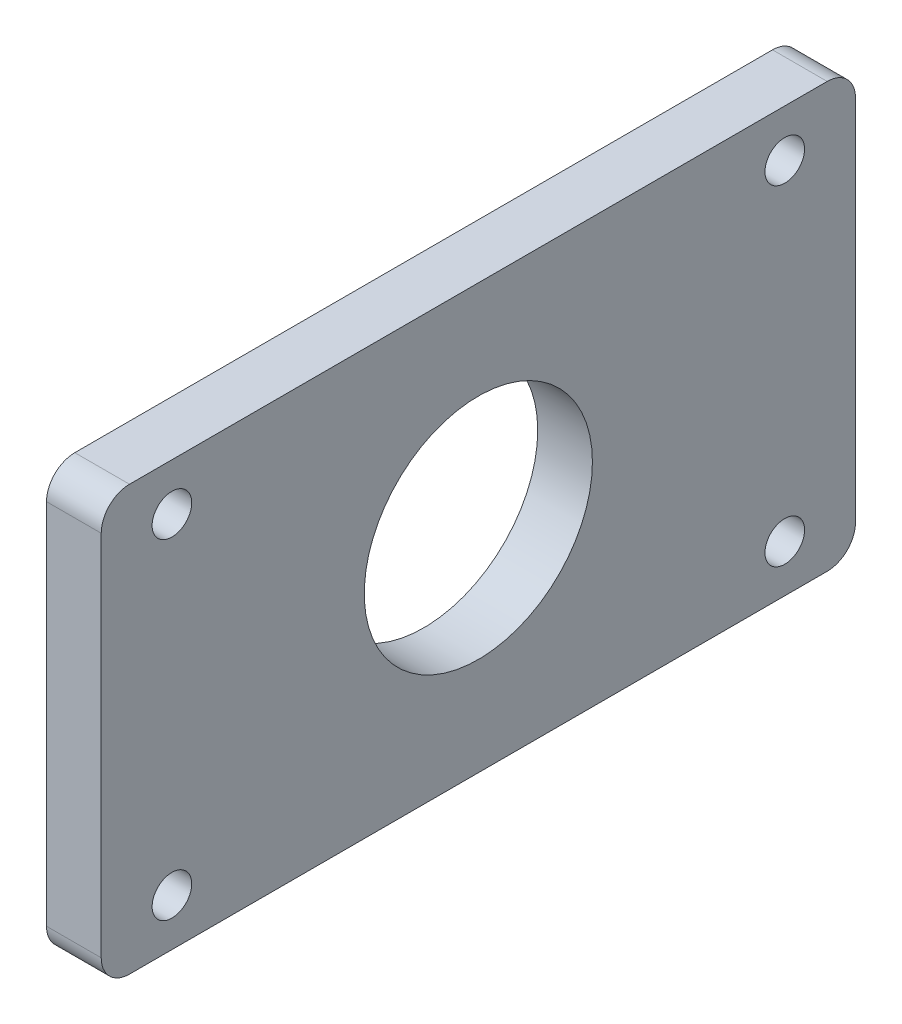
ISO-10303-21;
HEADER;
FILE_DESCRIPTION(('STEP AP214'),'2;1');
FILE_NAME('part.step','',(''),(''),'','','');
FILE_SCHEMA(('AUTOMOTIVE_DESIGN { 1 0 10303 214 1 1 1 1 }'));
ENDSEC;
DATA;
#1=APPLICATION_CONTEXT('core data for automotive mechanical design processes');
#2=APPLICATION_PROTOCOL_DEFINITION('international standard','automotive_design',2000,#1);
#3=PRODUCT_CONTEXT('',#1,'mechanical');
#4=PRODUCT('Part','Part','',(#3));
#5=PRODUCT_RELATED_PRODUCT_CATEGORY('part','',(#4));
#6=PRODUCT_DEFINITION_FORMATION('','',#4);
#7=PRODUCT_DEFINITION_CONTEXT('part definition',#1,'design');
#8=PRODUCT_DEFINITION('design','',#6,#7);
#9=PRODUCT_DEFINITION_SHAPE('','',#8);
#10=(LENGTH_UNIT() NAMED_UNIT(*) SI_UNIT(.MILLI.,.METRE.));
#11=(NAMED_UNIT(*) PLANE_ANGLE_UNIT() SI_UNIT($,.RADIAN.));
#12=(NAMED_UNIT(*) SI_UNIT($,.STERADIAN.) SOLID_ANGLE_UNIT());
#13=UNCERTAINTY_MEASURE_WITH_UNIT(LENGTH_MEASURE(1.E-05),#10,'distance_accuracy_value','');
#14=(GEOMETRIC_REPRESENTATION_CONTEXT(3) GLOBAL_UNCERTAINTY_ASSIGNED_CONTEXT((#13)) GLOBAL_UNIT_ASSIGNED_CONTEXT((#10,
#11,#12)) REPRESENTATION_CONTEXT('',''));
#15=CARTESIAN_POINT('',(0.,0.,0.));
#16=DIRECTION('',(0.,0.,1.));
#17=DIRECTION('',(1.,0.,0.));
#18=AXIS2_PLACEMENT_3D('',#15,#16,#17);
#19=CARTESIAN_POINT('',(5.8,0.,0.));
#20=DIRECTION('',(1.,0.,0.));
#21=DIRECTION('',(0.,0.,-1.));
#22=AXIS2_PLACEMENT_3D('',#19,#20,#21);
#23=PLANE('',#22);
#24=CARTESIAN_POINT('',(5.8,17.5,32.5));
#25=DIRECTION('',(1.,0.,0.));
#26=DIRECTION('',(0.,0.,1.));
#27=AXIS2_PLACEMENT_3D('',#24,#25,#26);
#28=CIRCLE('',#27,2.09999999999999);
#29=CARTESIAN_POINT('',(5.8,17.5,34.6));
#30=VERTEX_POINT('',#29);
#31=EDGE_CURVE('E358',#30,#30,#28,.T.);
#32=ORIENTED_EDGE('',*,*,#31,.F.);
#33=EDGE_LOOP('',(#32));
#34=FACE_BOUND('',#33,.T.);
#35=CARTESIAN_POINT('',(5.8,17.5,-32.5));
#36=DIRECTION('',(1.,0.,0.));
#37=DIRECTION('',(0.,0.,-1.));
#38=AXIS2_PLACEMENT_3D('',#35,#36,#37);
#39=CIRCLE('',#38,2.1);
#40=CARTESIAN_POINT('',(5.8,17.5,-34.6));
#41=VERTEX_POINT('',#40);
#42=EDGE_CURVE('E343',#41,#41,#39,.T.);
#43=ORIENTED_EDGE('',*,*,#42,.F.);
#44=EDGE_LOOP('',(#43));
#45=FACE_BOUND('',#44,.T.);
#46=DIRECTION('',(0.,0.,-1.));
#47=VECTOR('',#46,1.);
#48=CARTESIAN_POINT('',(5.8,-22.5,40.));
#49=LINE('',#48,#47);
#50=CARTESIAN_POINT('',(5.8,-22.5,37.));
#51=VERTEX_POINT('',#50);
#52=CARTESIAN_POINT('',(5.8,-22.5,-37.));
#53=VERTEX_POINT('',#52);
#54=EDGE_CURVE('E139',#51,#53,#49,.T.);
#55=ORIENTED_EDGE('',*,*,#54,.T.);
#56=CARTESIAN_POINT('',(5.8,-19.5,-37.));
#57=DIRECTION('',(1.,0.,0.));
#58=DIRECTION('',(0.,0.,-1.));
#59=AXIS2_PLACEMENT_3D('',#56,#57,#58);
#60=CIRCLE('',#59,3.);
#61=CARTESIAN_POINT('',(5.8,-19.5,-40.));
#62=VERTEX_POINT('',#61);
#63=EDGE_CURVE('E179',#53,#62,#60,.T.);
#64=ORIENTED_EDGE('',*,*,#63,.T.);
#65=DIRECTION('',(0.,1.,0.));
#66=VECTOR('',#65,1.);
#67=CARTESIAN_POINT('',(5.8,22.5,-40.));
#68=LINE('',#67,#66);
#69=CARTESIAN_POINT('',(5.8,19.5,-40.));
#70=VERTEX_POINT('',#69);
#71=EDGE_CURVE('E122',#62,#70,#68,.T.);
#72=ORIENTED_EDGE('',*,*,#71,.T.);
#73=CARTESIAN_POINT('',(5.8,19.5,-37.));
#74=DIRECTION('',(1.,0.,0.));
#75=DIRECTION('',(0.,0.,-1.));
#76=AXIS2_PLACEMENT_3D('',#73,#74,#75);
#77=CIRCLE('',#76,3.);
#78=CARTESIAN_POINT('',(5.8,22.5,-37.));
#79=VERTEX_POINT('',#78);
#80=EDGE_CURVE('E177',#70,#79,#77,.T.);
#81=ORIENTED_EDGE('',*,*,#80,.T.);
#82=DIRECTION('',(0.,0.,1.));
#83=VECTOR('',#82,1.);
#84=CARTESIAN_POINT('',(5.8,22.5,40.));
#85=LINE('',#84,#83);
#86=CARTESIAN_POINT('',(5.8,22.5,37.));
#87=VERTEX_POINT('',#86);
#88=EDGE_CURVE('E168',#79,#87,#85,.T.);
#89=ORIENTED_EDGE('',*,*,#88,.T.);
#90=CARTESIAN_POINT('',(5.8,19.5,37.));
#91=DIRECTION('',(1.,0.,0.));
#92=DIRECTION('',(0.,0.,-1.));
#93=AXIS2_PLACEMENT_3D('',#90,#91,#92);
#94=CIRCLE('',#93,3.);
#95=CARTESIAN_POINT('',(5.8,19.5,40.));
#96=VERTEX_POINT('',#95);
#97=EDGE_CURVE('E57',#87,#96,#94,.T.);
#98=ORIENTED_EDGE('',*,*,#97,.T.);
#99=DIRECTION('',(0.,-1.,0.));
#100=VECTOR('',#99,1.);
#101=CARTESIAN_POINT('',(5.8,22.5,40.));
#102=LINE('',#101,#100);
#103=CARTESIAN_POINT('',(5.8,-19.5,40.));
#104=VERTEX_POINT('',#103);
#105=EDGE_CURVE('E166',#96,#104,#102,.T.);
#106=ORIENTED_EDGE('',*,*,#105,.T.);
#107=CARTESIAN_POINT('',(5.8,-19.5,37.));
#108=DIRECTION('',(1.,0.,0.));
#109=DIRECTION('',(0.,0.,-1.));
#110=AXIS2_PLACEMENT_3D('',#107,#108,#109);
#111=CIRCLE('',#110,3.);
#112=EDGE_CURVE('E156',#104,#51,#111,.T.);
#113=ORIENTED_EDGE('',*,*,#112,.T.);
#114=EDGE_LOOP('',(#55,#64,#72,#81,#89,#98,#106,#113));
#115=FACE_BOUND('',#114,.T.);
#116=CARTESIAN_POINT('',(5.8,0.,0.));
#117=DIRECTION('',(1.,0.,0.));
#118=DIRECTION('',(0.,0.,-1.));
#119=AXIS2_PLACEMENT_3D('',#116,#117,#118);
#120=CIRCLE('',#119,12.1);
#121=CARTESIAN_POINT('',(5.8,0.,-12.1));
#122=VERTEX_POINT('',#121);
#123=EDGE_CURVE('E130',#122,#122,#120,.T.);
#124=ORIENTED_EDGE('',*,*,#123,.F.);
#125=EDGE_LOOP('',(#124));
#126=FACE_BOUND('',#125,.T.);
#127=CARTESIAN_POINT('',(5.8,-17.5,-32.5));
#128=DIRECTION('',(1.,0.,0.));
#129=DIRECTION('',(0.,0.,1.));
#130=AXIS2_PLACEMENT_3D('',#127,#128,#129);
#131=CIRCLE('',#130,2.1);
#132=CARTESIAN_POINT('',(5.8,-17.5,-30.4));
#133=VERTEX_POINT('',#132);
#134=EDGE_CURVE('E349',#133,#133,#131,.T.);
#135=ORIENTED_EDGE('',*,*,#134,.F.);
#136=EDGE_LOOP('',(#135));
#137=FACE_BOUND('',#136,.T.);
#138=CARTESIAN_POINT('',(5.8,-17.5,32.5));
#139=DIRECTION('',(1.,0.,0.));
#140=DIRECTION('',(0.,0.,-1.));
#141=AXIS2_PLACEMENT_3D('',#138,#139,#140);
#142=CIRCLE('',#141,2.09999999999999);
#143=CARTESIAN_POINT('',(5.8,-17.5,30.4));
#144=VERTEX_POINT('',#143);
#145=EDGE_CURVE('E366',#144,#144,#142,.T.);
#146=ORIENTED_EDGE('',*,*,#145,.F.);
#147=EDGE_LOOP('',(#146));
#148=FACE_BOUND('',#147,.T.);
#149=ADVANCED_FACE('F37',(#34,#45,#115,#126,#137,#148),#23,.T.);
#150=CARTESIAN_POINT('',(0.,0.,0.));
#151=DIRECTION('',(1.,0.,0.));
#152=DIRECTION('',(0.,0.,-1.));
#153=AXIS2_PLACEMENT_3D('',#150,#151,#152);
#154=PLANE('',#153);
#155=DIRECTION('',(0.,1.,0.));
#156=VECTOR('',#155,1.);
#157=CARTESIAN_POINT('',(0.,22.5,-40.));
#158=LINE('',#157,#156);
#159=CARTESIAN_POINT('',(0.,-19.5,-40.));
#160=VERTEX_POINT('',#159);
#161=CARTESIAN_POINT('',(0.,19.5,-40.));
#162=VERTEX_POINT('',#161);
#163=EDGE_CURVE('E119',#160,#162,#158,.T.);
#164=ORIENTED_EDGE('',*,*,#163,.F.);
#165=CARTESIAN_POINT('',(0.,-19.5,-37.));
#166=DIRECTION('',(1.,0.,0.));
#167=DIRECTION('',(0.,0.,-1.));
#168=AXIS2_PLACEMENT_3D('',#165,#166,#167);
#169=CIRCLE('',#168,3.);
#170=CARTESIAN_POINT('',(0.,-22.5,-37.));
#171=VERTEX_POINT('',#170);
#172=EDGE_CURVE('E102',#160,#171,#169,.F.);
#173=ORIENTED_EDGE('',*,*,#172,.T.);
#174=DIRECTION('',(0.,0.,-1.));
#175=VECTOR('',#174,1.);
#176=CARTESIAN_POINT('',(0.,-22.5,40.));
#177=LINE('',#176,#175);
#178=CARTESIAN_POINT('',(0.,-22.5,37.));
#179=VERTEX_POINT('',#178);
#180=EDGE_CURVE('E144',#179,#171,#177,.T.);
#181=ORIENTED_EDGE('',*,*,#180,.F.);
#182=CARTESIAN_POINT('',(0.,-19.5,37.));
#183=DIRECTION('',(1.,0.,0.));
#184=DIRECTION('',(0.,0.,-1.));
#185=AXIS2_PLACEMENT_3D('',#182,#183,#184);
#186=CIRCLE('',#185,3.);
#187=CARTESIAN_POINT('',(0.,-19.5,40.));
#188=VERTEX_POINT('',#187);
#189=EDGE_CURVE('E148',#179,#188,#186,.F.);
#190=ORIENTED_EDGE('',*,*,#189,.T.);
#191=DIRECTION('',(0.,-1.,0.));
#192=VECTOR('',#191,1.);
#193=CARTESIAN_POINT('',(0.,22.5,40.));
#194=LINE('',#193,#192);
#195=CARTESIAN_POINT('',(0.,19.5,40.));
#196=VERTEX_POINT('',#195);
#197=EDGE_CURVE('E133',#196,#188,#194,.T.);
#198=ORIENTED_EDGE('',*,*,#197,.F.);
#199=CARTESIAN_POINT('',(0.,19.5,37.));
#200=DIRECTION('',(1.,0.,0.));
#201=DIRECTION('',(0.,0.,-1.));
#202=AXIS2_PLACEMENT_3D('',#199,#200,#201);
#203=CIRCLE('',#202,3.);
#204=CARTESIAN_POINT('',(0.,22.5,37.));
#205=VERTEX_POINT('',#204);
#206=EDGE_CURVE('E123',#196,#205,#203,.F.);
#207=ORIENTED_EDGE('',*,*,#206,.T.);
#208=DIRECTION('',(0.,0.,1.));
#209=VECTOR('',#208,1.);
#210=CARTESIAN_POINT('',(0.,22.5,40.));
#211=LINE('',#210,#209);
#212=CARTESIAN_POINT('',(0.,22.5,-37.));
#213=VERTEX_POINT('',#212);
#214=EDGE_CURVE('E129',#213,#205,#211,.T.);
#215=ORIENTED_EDGE('',*,*,#214,.F.);
#216=CARTESIAN_POINT('',(0.,19.5,-37.));
#217=DIRECTION('',(1.,0.,0.));
#218=DIRECTION('',(0.,0.,-1.));
#219=AXIS2_PLACEMENT_3D('',#216,#217,#218);
#220=CIRCLE('',#219,3.);
#221=EDGE_CURVE('E113',#213,#162,#220,.F.);
#222=ORIENTED_EDGE('',*,*,#221,.T.);
#223=EDGE_LOOP('',(#164,#173,#181,#190,#198,#207,#215,#222));
#224=FACE_BOUND('',#223,.T.);
#225=CARTESIAN_POINT('',(0.,0.,0.));
#226=DIRECTION('',(1.,0.,0.));
#227=DIRECTION('',(0.,0.,-1.));
#228=AXIS2_PLACEMENT_3D('',#225,#226,#227);
#229=CIRCLE('',#228,12.1);
#230=CARTESIAN_POINT('',(0.,0.,-12.1));
#231=VERTEX_POINT('',#230);
#232=EDGE_CURVE('E136',#231,#231,#229,.T.);
#233=ORIENTED_EDGE('',*,*,#232,.T.);
#234=EDGE_LOOP('',(#233));
#235=FACE_BOUND('',#234,.T.);
#236=CARTESIAN_POINT('',(0.,17.5,-32.5));
#237=DIRECTION('',(1.,0.,0.));
#238=DIRECTION('',(0.,0.,-1.));
#239=AXIS2_PLACEMENT_3D('',#236,#237,#238);
#240=CIRCLE('',#239,2.1);
#241=CARTESIAN_POINT('',(0.,17.5,-34.6));
#242=VERTEX_POINT('',#241);
#243=EDGE_CURVE('E345',#242,#242,#240,.T.);
#244=ORIENTED_EDGE('',*,*,#243,.T.);
#245=EDGE_LOOP('',(#244));
#246=FACE_BOUND('',#245,.T.);
#247=CARTESIAN_POINT('',(0.,-17.5,-32.5));
#248=DIRECTION('',(1.,0.,0.));
#249=DIRECTION('',(0.,0.,1.));
#250=AXIS2_PLACEMENT_3D('',#247,#248,#249);
#251=CIRCLE('',#250,2.1);
#252=CARTESIAN_POINT('',(0.,-17.5,-30.4));
#253=VERTEX_POINT('',#252);
#254=EDGE_CURVE('E353',#253,#253,#251,.T.);
#255=ORIENTED_EDGE('',*,*,#254,.T.);
#256=EDGE_LOOP('',(#255));
#257=FACE_BOUND('',#256,.T.);
#258=CARTESIAN_POINT('',(0.,17.5,32.5));
#259=DIRECTION('',(1.,0.,0.));
#260=DIRECTION('',(0.,0.,1.));
#261=AXIS2_PLACEMENT_3D('',#258,#259,#260);
#262=CIRCLE('',#261,2.09999999999999);
#263=CARTESIAN_POINT('',(0.,17.5,34.6));
#264=VERTEX_POINT('',#263);
#265=EDGE_CURVE('E363',#264,#264,#262,.T.);
#266=ORIENTED_EDGE('',*,*,#265,.T.);
#267=EDGE_LOOP('',(#266));
#268=FACE_BOUND('',#267,.T.);
#269=CARTESIAN_POINT('',(0.,-17.5,32.5));
#270=DIRECTION('',(1.,0.,0.));
#271=DIRECTION('',(0.,0.,-1.));
#272=AXIS2_PLACEMENT_3D('',#269,#270,#271);
#273=CIRCLE('',#272,2.09999999999999);
#274=CARTESIAN_POINT('',(0.,-17.5,30.4));
#275=VERTEX_POINT('',#274);
#276=EDGE_CURVE('E364',#275,#275,#273,.T.);
#277=ORIENTED_EDGE('',*,*,#276,.T.);
#278=EDGE_LOOP('',(#277));
#279=FACE_BOUND('',#278,.T.);
#280=ADVANCED_FACE('F126',(#224,#235,#246,#257,#268,#279),#154,.F.);
#281=CARTESIAN_POINT('',(5.8,22.5,-40.));
#282=DIRECTION('',(0.,0.,1.));
#283=DIRECTION('',(1.,0.,0.));
#284=AXIS2_PLACEMENT_3D('',#281,#282,#283);
#285=PLANE('',#284);
#286=ORIENTED_EDGE('',*,*,#71,.F.);
#287=DIRECTION('',(-1.,0.,0.));
#288=VECTOR('',#287,1.);
#289=CARTESIAN_POINT('',(5.8,-19.5,-40.));
#290=LINE('',#289,#288);
#291=EDGE_CURVE('E106',#62,#160,#290,.T.);
#292=ORIENTED_EDGE('',*,*,#291,.T.);
#293=ORIENTED_EDGE('',*,*,#163,.T.);
#294=DIRECTION('',(-1.,0.,0.));
#295=VECTOR('',#294,1.);
#296=CARTESIAN_POINT('',(5.8,19.5,-40.));
#297=LINE('',#296,#295);
#298=EDGE_CURVE('E124',#162,#70,#297,.F.);
#299=ORIENTED_EDGE('',*,*,#298,.T.);
#300=EDGE_LOOP('',(#286,#292,#293,#299));
#301=FACE_BOUND('',#300,.T.);
#302=ADVANCED_FACE('F118',(#301),#285,.F.);
#303=CARTESIAN_POINT('',(5.8,22.5,40.));
#304=DIRECTION('',(0.,-1.,0.));
#305=DIRECTION('',(0.,0.,-1.));
#306=AXIS2_PLACEMENT_3D('',#303,#304,#305);
#307=PLANE('',#306);
#308=ORIENTED_EDGE('',*,*,#88,.F.);
#309=DIRECTION('',(-1.,0.,0.));
#310=VECTOR('',#309,1.);
#311=CARTESIAN_POINT('',(5.8,22.5,-37.));
#312=LINE('',#311,#310);
#313=EDGE_CURVE('E184',#79,#213,#312,.T.);
#314=ORIENTED_EDGE('',*,*,#313,.T.);
#315=ORIENTED_EDGE('',*,*,#214,.T.);
#316=DIRECTION('',(-1.,0.,0.));
#317=VECTOR('',#316,1.);
#318=CARTESIAN_POINT('',(5.8,22.5,37.));
#319=LINE('',#318,#317);
#320=EDGE_CURVE('E182',#205,#87,#319,.F.);
#321=ORIENTED_EDGE('',*,*,#320,.T.);
#322=EDGE_LOOP('',(#308,#314,#315,#321));
#323=FACE_BOUND('',#322,.T.);
#324=ADVANCED_FACE('F206',(#323),#307,.F.);
#325=CARTESIAN_POINT('',(5.8,22.5,40.));
#326=DIRECTION('',(0.,0.,-1.));
#327=DIRECTION('',(0.,1.,0.));
#328=AXIS2_PLACEMENT_3D('',#325,#326,#327);
#329=PLANE('',#328);
#330=ORIENTED_EDGE('',*,*,#197,.T.);
#331=DIRECTION('',(-1.,0.,0.));
#332=VECTOR('',#331,1.);
#333=CARTESIAN_POINT('',(5.8,-19.5,40.));
#334=LINE('',#333,#332);
#335=EDGE_CURVE('E12',#188,#104,#334,.F.);
#336=ORIENTED_EDGE('',*,*,#335,.T.);
#337=ORIENTED_EDGE('',*,*,#105,.F.);
#338=DIRECTION('',(-1.,0.,0.));
#339=VECTOR('',#338,1.);
#340=CARTESIAN_POINT('',(5.8,19.5,40.));
#341=LINE('',#340,#339);
#342=EDGE_CURVE('E45',#96,#196,#341,.T.);
#343=ORIENTED_EDGE('',*,*,#342,.T.);
#344=EDGE_LOOP('',(#330,#336,#337,#343));
#345=FACE_BOUND('',#344,.T.);
#346=ADVANCED_FACE('F189',(#345),#329,.F.);
#347=CARTESIAN_POINT('',(5.8,-22.5,40.));
#348=DIRECTION('',(0.,1.,0.));
#349=DIRECTION('',(0.,0.,1.));
#350=AXIS2_PLACEMENT_3D('',#347,#348,#349);
#351=PLANE('',#350);
#352=ORIENTED_EDGE('',*,*,#180,.T.);
#353=DIRECTION('',(-1.,0.,0.));
#354=VECTOR('',#353,1.);
#355=CARTESIAN_POINT('',(5.8,-22.5,-37.));
#356=LINE('',#355,#354);
#357=EDGE_CURVE('E107',#171,#53,#356,.F.);
#358=ORIENTED_EDGE('',*,*,#357,.T.);
#359=ORIENTED_EDGE('',*,*,#54,.F.);
#360=DIRECTION('',(-1.,0.,0.));
#361=VECTOR('',#360,1.);
#362=CARTESIAN_POINT('',(5.8,-22.5,37.));
#363=LINE('',#362,#361);
#364=EDGE_CURVE('E112',#51,#179,#363,.T.);
#365=ORIENTED_EDGE('',*,*,#364,.T.);
#366=EDGE_LOOP('',(#352,#358,#359,#365));
#367=FACE_BOUND('',#366,.T.);
#368=ADVANCED_FACE('F197',(#367),#351,.F.);
#369=CARTESIAN_POINT('',(5.8,0.,0.));
#370=DIRECTION('',(-1.,0.,0.));
#371=DIRECTION('',(0.,0.,1.));
#372=AXIS2_PLACEMENT_3D('',#369,#370,#371);
#373=CYLINDRICAL_SURFACE('',#372,12.1);
#374=ORIENTED_EDGE('',*,*,#123,.T.);
#375=EDGE_LOOP('',(#374));
#376=FACE_BOUND('',#375,.T.);
#377=ORIENTED_EDGE('',*,*,#232,.F.);
#378=EDGE_LOOP('',(#377));
#379=FACE_BOUND('',#378,.T.);
#380=ADVANCED_FACE('F222',(#376,#379),#373,.F.);
#381=CARTESIAN_POINT('',(5.8,17.5,-32.5));
#382=DIRECTION('',(-1.,0.,0.));
#383=DIRECTION('',(0.,0.,1.));
#384=AXIS2_PLACEMENT_3D('',#381,#382,#383);
#385=CYLINDRICAL_SURFACE('',#384,2.1);
#386=ORIENTED_EDGE('',*,*,#42,.T.);
#387=EDGE_LOOP('',(#386));
#388=FACE_BOUND('',#387,.T.);
#389=ORIENTED_EDGE('',*,*,#243,.F.);
#390=EDGE_LOOP('',(#389));
#391=FACE_BOUND('',#390,.T.);
#392=ADVANCED_FACE('F284',(#388,#391),#385,.F.);
#393=CARTESIAN_POINT('',(5.8,-17.5,-32.5));
#394=DIRECTION('',(-1.,0.,0.));
#395=DIRECTION('',(0.,0.,1.));
#396=AXIS2_PLACEMENT_3D('',#393,#394,#395);
#397=CYLINDRICAL_SURFACE('',#396,2.1);
#398=ORIENTED_EDGE('',*,*,#134,.T.);
#399=EDGE_LOOP('',(#398));
#400=FACE_BOUND('',#399,.T.);
#401=ORIENTED_EDGE('',*,*,#254,.F.);
#402=EDGE_LOOP('',(#401));
#403=FACE_BOUND('',#402,.T.);
#404=ADVANCED_FACE('F275',(#400,#403),#397,.F.);
#405=CARTESIAN_POINT('',(5.8,17.5,32.5));
#406=DIRECTION('',(-1.,0.,0.));
#407=DIRECTION('',(0.,0.,1.));
#408=AXIS2_PLACEMENT_3D('',#405,#406,#407);
#409=CYLINDRICAL_SURFACE('',#408,2.09999999999999);
#410=ORIENTED_EDGE('',*,*,#31,.T.);
#411=EDGE_LOOP('',(#410));
#412=FACE_BOUND('',#411,.T.);
#413=ORIENTED_EDGE('',*,*,#265,.F.);
#414=EDGE_LOOP('',(#413));
#415=FACE_BOUND('',#414,.T.);
#416=ADVANCED_FACE('F266',(#412,#415),#409,.F.);
#417=CARTESIAN_POINT('',(5.8,-17.5,32.5));
#418=DIRECTION('',(-1.,0.,0.));
#419=DIRECTION('',(0.,0.,1.));
#420=AXIS2_PLACEMENT_3D('',#417,#418,#419);
#421=CYLINDRICAL_SURFACE('',#420,2.09999999999999);
#422=ORIENTED_EDGE('',*,*,#145,.T.);
#423=EDGE_LOOP('',(#422));
#424=FACE_BOUND('',#423,.T.);
#425=ORIENTED_EDGE('',*,*,#276,.F.);
#426=EDGE_LOOP('',(#425));
#427=FACE_BOUND('',#426,.T.);
#428=ADVANCED_FACE('F235',(#424,#427),#421,.F.);
#429=CARTESIAN_POINT('',(5.8,-19.5,-37.));
#430=DIRECTION('',(-1.,0.,0.));
#431=DIRECTION('',(0.,0.,1.));
#432=AXIS2_PLACEMENT_3D('',#429,#430,#431);
#433=CYLINDRICAL_SURFACE('',#432,3.);
#434=ORIENTED_EDGE('',*,*,#63,.F.);
#435=ORIENTED_EDGE('',*,*,#357,.F.);
#436=ORIENTED_EDGE('',*,*,#172,.F.);
#437=ORIENTED_EDGE('',*,*,#291,.F.);
#438=EDGE_LOOP('',(#434,#435,#436,#437));
#439=FACE_BOUND('',#438,.T.);
#440=ADVANCED_FACE('F105',(#439),#433,.T.);
#441=CARTESIAN_POINT('',(5.8,19.5,-37.));
#442=DIRECTION('',(-1.,0.,0.));
#443=DIRECTION('',(0.,0.,1.));
#444=AXIS2_PLACEMENT_3D('',#441,#442,#443);
#445=CYLINDRICAL_SURFACE('',#444,3.);
#446=ORIENTED_EDGE('',*,*,#80,.F.);
#447=ORIENTED_EDGE('',*,*,#298,.F.);
#448=ORIENTED_EDGE('',*,*,#221,.F.);
#449=ORIENTED_EDGE('',*,*,#313,.F.);
#450=EDGE_LOOP('',(#446,#447,#448,#449));
#451=FACE_BOUND('',#450,.T.);
#452=ADVANCED_FACE('F204',(#451),#445,.T.);
#453=CARTESIAN_POINT('',(5.8,-19.5,37.));
#454=DIRECTION('',(-1.,0.,0.));
#455=DIRECTION('',(0.,0.,1.));
#456=AXIS2_PLACEMENT_3D('',#453,#454,#455);
#457=CYLINDRICAL_SURFACE('',#456,3.);
#458=ORIENTED_EDGE('',*,*,#112,.F.);
#459=ORIENTED_EDGE('',*,*,#335,.F.);
#460=ORIENTED_EDGE('',*,*,#189,.F.);
#461=ORIENTED_EDGE('',*,*,#364,.F.);
#462=EDGE_LOOP('',(#458,#459,#460,#461));
#463=FACE_BOUND('',#462,.T.);
#464=ADVANCED_FACE('F194',(#463),#457,.T.);
#465=CARTESIAN_POINT('',(5.8,19.5,37.));
#466=DIRECTION('',(-1.,0.,0.));
#467=DIRECTION('',(0.,0.,1.));
#468=AXIS2_PLACEMENT_3D('',#465,#466,#467);
#469=CYLINDRICAL_SURFACE('',#468,3.);
#470=ORIENTED_EDGE('',*,*,#97,.F.);
#471=ORIENTED_EDGE('',*,*,#320,.F.);
#472=ORIENTED_EDGE('',*,*,#206,.F.);
#473=ORIENTED_EDGE('',*,*,#342,.F.);
#474=EDGE_LOOP('',(#470,#471,#472,#473));
#475=FACE_BOUND('',#474,.T.);
#476=ADVANCED_FACE('F39',(#475),#469,.T.);
#477=CLOSED_SHELL('',(#149,#280,#302,#324,#346,#368,#380,#392,#404,#416,#428,#440,#452,#464,#476));
#478=MANIFOLD_SOLID_BREP('B2',#477);
#479=ADVANCED_BREP_SHAPE_REPRESENTATION('',(#18,#478),#14);
#480=SHAPE_DEFINITION_REPRESENTATION(#9,#479);
ENDSEC;
END-ISO-10303-21;
